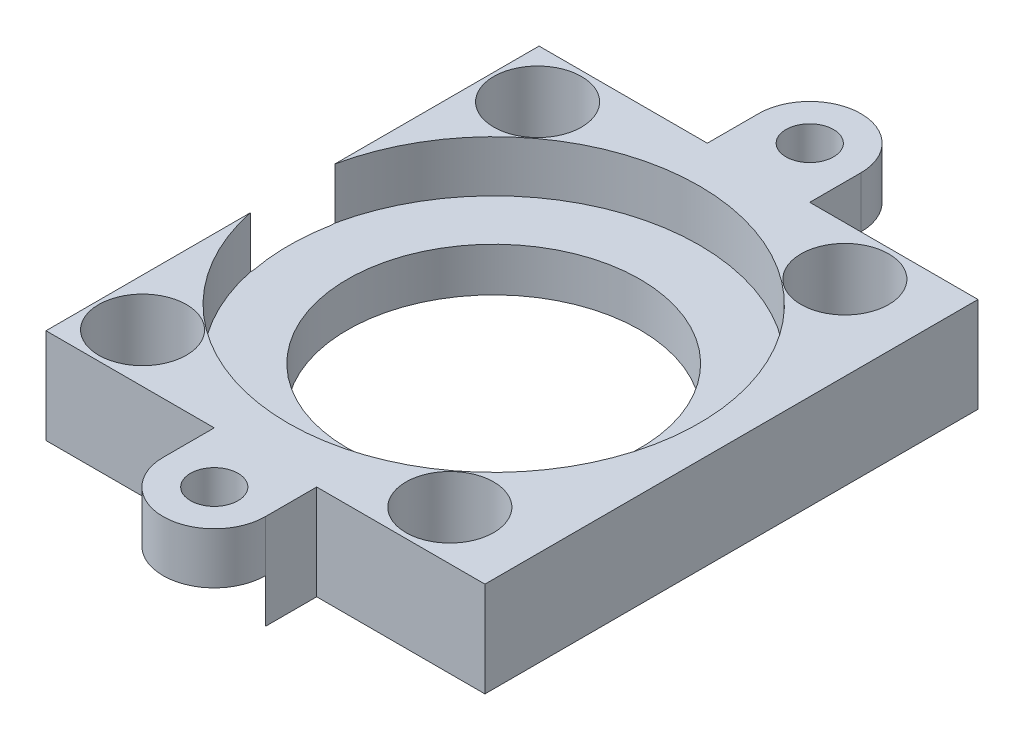
ISO-10303-21;
HEADER;
FILE_DESCRIPTION(('STEP AP214'),'2;1');
FILE_NAME('part.step','',(''),(''),'','','');
FILE_SCHEMA(('AUTOMOTIVE_DESIGN { 1 0 10303 214 1 1 1 1 }'));
ENDSEC;
DATA;
#1=APPLICATION_CONTEXT('core data for automotive mechanical design processes');
#2=APPLICATION_PROTOCOL_DEFINITION('international standard','automotive_design',2000,#1);
#3=PRODUCT_CONTEXT('',#1,'mechanical');
#4=PRODUCT('Part','Part','',(#3));
#5=PRODUCT_RELATED_PRODUCT_CATEGORY('part','',(#4));
#6=PRODUCT_DEFINITION_FORMATION('','',#4);
#7=PRODUCT_DEFINITION_CONTEXT('part definition',#1,'design');
#8=PRODUCT_DEFINITION('design','',#6,#7);
#9=PRODUCT_DEFINITION_SHAPE('','',#8);
#10=(LENGTH_UNIT() NAMED_UNIT(*) SI_UNIT(.MILLI.,.METRE.));
#11=(NAMED_UNIT(*) PLANE_ANGLE_UNIT() SI_UNIT($,.RADIAN.));
#12=(NAMED_UNIT(*) SI_UNIT($,.STERADIAN.) SOLID_ANGLE_UNIT());
#13=UNCERTAINTY_MEASURE_WITH_UNIT(LENGTH_MEASURE(1.E-05),#10,'distance_accuracy_value','');
#14=(GEOMETRIC_REPRESENTATION_CONTEXT(3) GLOBAL_UNCERTAINTY_ASSIGNED_CONTEXT((#13)) GLOBAL_UNIT_ASSIGNED_CONTEXT((#10,
#11,#12)) REPRESENTATION_CONTEXT('',''));
#15=CARTESIAN_POINT('',(0.,0.,0.));
#16=DIRECTION('',(0.,0.,1.));
#17=DIRECTION('',(1.,0.,0.));
#18=AXIS2_PLACEMENT_3D('',#15,#16,#17);
#19=CARTESIAN_POINT('',(0.,15.5,20.35));
#20=DIRECTION('',(0.,-1.,0.));
#21=DIRECTION('',(0.,0.,-1.));
#22=AXIS2_PLACEMENT_3D('',#19,#20,#21);
#23=CYLINDRICAL_SURFACE('',#22,3.5);
#24=DIRECTION('',(0.,-1.,0.));
#25=VECTOR('',#24,1.);
#26=CARTESIAN_POINT('',(-3.5,15.5,20.35));
#27=LINE('',#26,#25);
#28=CARTESIAN_POINT('',(-3.5,15.5,20.35));
#29=VERTEX_POINT('',#28);
#30=CARTESIAN_POINT('',(-3.5,12.,20.35));
#31=VERTEX_POINT('',#30);
#32=EDGE_CURVE('E321',#29,#31,#27,.T.);
#33=ORIENTED_EDGE('',*,*,#32,.T.);
#34=CARTESIAN_POINT('',(0.,12.,20.35));
#35=DIRECTION('',(0.,-1.,0.));
#36=DIRECTION('',(0.,0.,-1.));
#37=AXIS2_PLACEMENT_3D('',#34,#35,#36);
#38=CIRCLE('',#37,3.5);
#39=CARTESIAN_POINT('',(3.5,12.,20.35));
#40=VERTEX_POINT('',#39);
#41=EDGE_CURVE('E233',#40,#31,#38,.T.);
#42=ORIENTED_EDGE('',*,*,#41,.F.);
#43=DIRECTION('',(0.,-1.,0.));
#44=VECTOR('',#43,1.);
#45=CARTESIAN_POINT('',(3.5,15.5,20.35));
#46=LINE('',#45,#44);
#47=CARTESIAN_POINT('',(3.5,15.5,20.35));
#48=VERTEX_POINT('',#47);
#49=EDGE_CURVE('E326',#48,#40,#46,.T.);
#50=ORIENTED_EDGE('',*,*,#49,.F.);
#51=CARTESIAN_POINT('',(0.,15.5,20.35));
#52=DIRECTION('',(0.,-1.,0.));
#53=DIRECTION('',(0.,0.,-1.));
#54=AXIS2_PLACEMENT_3D('',#51,#52,#53);
#55=CIRCLE('',#54,3.5);
#56=EDGE_CURVE('E295',#48,#29,#55,.T.);
#57=ORIENTED_EDGE('',*,*,#56,.T.);
#58=EDGE_LOOP('',(#33,#42,#50,#57));
#59=FACE_BOUND('',#58,.T.);
#60=ADVANCED_FACE('F40',(#59),#23,.T.);
#61=CARTESIAN_POINT('',(0.,15.5,20.35));
#62=DIRECTION('',(0.,-1.,0.));
#63=DIRECTION('',(0.,0.,-1.));
#64=AXIS2_PLACEMENT_3D('',#61,#62,#63);
#65=CYLINDRICAL_SURFACE('',#64,1.625);
#66=CARTESIAN_POINT('',(0.,15.5,20.35));
#67=DIRECTION('',(0.,-1.,0.));
#68=DIRECTION('',(0.,0.,-1.));
#69=AXIS2_PLACEMENT_3D('',#66,#67,#68);
#70=CIRCLE('',#69,1.625);
#71=CARTESIAN_POINT('',(0.,15.5,18.725));
#72=VERTEX_POINT('',#71);
#73=EDGE_CURVE('E303',#72,#72,#70,.T.);
#74=CARTESIAN_POINT('',(0.,12.,20.35));
#75=DIRECTION('',(0.,-1.,0.));
#76=DIRECTION('',(0.,0.,-1.));
#77=AXIS2_PLACEMENT_3D('',#74,#75,#76);
#78=CIRCLE('',#77,1.625);
#79=CARTESIAN_POINT('',(0.,12.,18.725));
#80=VERTEX_POINT('',#79);
#81=EDGE_CURVE('E227',#80,#80,#78,.T.);
#82=CARTESIAN_POINT('',(0.,15.5,18.725));
#83=CARTESIAN_POINT('',(0.,15.4635416666667,18.725));
#84=CARTESIAN_POINT('',(0.,15.4270833333333,18.725));
#85=CARTESIAN_POINT('',(0.,15.3541666666667,18.725));
#86=CARTESIAN_POINT('',(0.,15.3177083333333,18.725));
#87=CARTESIAN_POINT('',(0.,15.2447916666667,18.725));
#88=CARTESIAN_POINT('',(0.,15.2083333333333,18.725));
#89=CARTESIAN_POINT('',(0.,15.1354166666667,18.725));
#90=CARTESIAN_POINT('',(0.,15.0989583333333,18.725));
#91=CARTESIAN_POINT('',(0.,15.0260416666667,18.725));
#92=CARTESIAN_POINT('',(0.,14.9895833333333,18.725));
#93=CARTESIAN_POINT('',(0.,14.9166666666667,18.725));
#94=CARTESIAN_POINT('',(0.,14.8802083333333,18.725));
#95=CARTESIAN_POINT('',(0.,14.8072916666667,18.725));
#96=CARTESIAN_POINT('',(0.,14.7708333333333,18.725));
#97=CARTESIAN_POINT('',(0.,14.6979166666667,18.725));
#98=CARTESIAN_POINT('',(0.,14.6614583333333,18.725));
#99=CARTESIAN_POINT('',(0.,14.5885416666667,18.725));
#100=CARTESIAN_POINT('',(0.,14.5520833333333,18.725));
#101=CARTESIAN_POINT('',(0.,14.4791666666667,18.725));
#102=CARTESIAN_POINT('',(0.,14.4427083333333,18.725));
#103=CARTESIAN_POINT('',(0.,14.3697916666667,18.725));
#104=CARTESIAN_POINT('',(0.,14.3333333333333,18.725));
#105=CARTESIAN_POINT('',(0.,14.2604166666667,18.725));
#106=CARTESIAN_POINT('',(0.,14.2239583333333,18.725));
#107=CARTESIAN_POINT('',(0.,14.1510416666667,18.725));
#108=CARTESIAN_POINT('',(0.,14.1145833333333,18.725));
#109=CARTESIAN_POINT('',(0.,14.0416666666667,18.725));
#110=CARTESIAN_POINT('',(0.,14.0052083333333,18.725));
#111=CARTESIAN_POINT('',(0.,13.9322916666667,18.725));
#112=CARTESIAN_POINT('',(0.,13.8958333333333,18.725));
#113=CARTESIAN_POINT('',(0.,13.8229166666667,18.725));
#114=CARTESIAN_POINT('',(0.,13.7864583333333,18.725));
#115=CARTESIAN_POINT('',(0.,13.7135416666667,18.725));
#116=CARTESIAN_POINT('',(0.,13.6770833333333,18.725));
#117=CARTESIAN_POINT('',(0.,13.6041666666667,18.725));
#118=CARTESIAN_POINT('',(0.,13.5677083333333,18.725));
#119=CARTESIAN_POINT('',(0.,13.4947916666667,18.725));
#120=CARTESIAN_POINT('',(0.,13.4583333333333,18.725));
#121=CARTESIAN_POINT('',(0.,13.3854166666667,18.725));
#122=CARTESIAN_POINT('',(0.,13.3489583333333,18.725));
#123=CARTESIAN_POINT('',(0.,13.2760416666667,18.725));
#124=CARTESIAN_POINT('',(0.,13.2395833333333,18.725));
#125=CARTESIAN_POINT('',(0.,13.1666666666667,18.725));
#126=CARTESIAN_POINT('',(0.,13.1302083333333,18.725));
#127=CARTESIAN_POINT('',(0.,13.0572916666667,18.725));
#128=CARTESIAN_POINT('',(0.,13.0208333333333,18.725));
#129=CARTESIAN_POINT('',(0.,12.9479166666667,18.725));
#130=CARTESIAN_POINT('',(0.,12.9114583333333,18.725));
#131=CARTESIAN_POINT('',(0.,12.8385416666667,18.725));
#132=CARTESIAN_POINT('',(0.,12.8020833333333,18.725));
#133=CARTESIAN_POINT('',(0.,12.7291666666667,18.725));
#134=CARTESIAN_POINT('',(0.,12.6927083333333,18.725));
#135=CARTESIAN_POINT('',(0.,12.6197916666667,18.725));
#136=CARTESIAN_POINT('',(0.,12.5833333333333,18.725));
#137=CARTESIAN_POINT('',(0.,12.5104166666667,18.725));
#138=CARTESIAN_POINT('',(0.,12.4739583333333,18.725));
#139=CARTESIAN_POINT('',(0.,12.4010416666667,18.725));
#140=CARTESIAN_POINT('',(0.,12.3645833333333,18.725));
#141=CARTESIAN_POINT('',(0.,12.2916666666667,18.725));
#142=CARTESIAN_POINT('',(0.,12.2552083333333,18.725));
#143=CARTESIAN_POINT('',(0.,12.1822916666667,18.725));
#144=CARTESIAN_POINT('',(0.,12.1458333333333,18.725));
#145=CARTESIAN_POINT('',(0.,12.0729166666667,18.725));
#146=CARTESIAN_POINT('',(0.,12.0364583333333,18.725));
#147=CARTESIAN_POINT('',(0.,12.,18.725));
#148=B_SPLINE_CURVE_WITH_KNOTS('',3,(#82,#83,#84,#85,#86,#87,#88,#89,#90,#91,#92,#93,#94,#95,
#96,#97,#98,#99,#100,#101,#102,#103,#104,#105,#106,#107,#108,#109,#110,#111,#112,#113,#114,#115,
#116,#117,#118,#119,#120,#121,#122,#123,#124,#125,#126,#127,#128,#129,#130,#131,#132,#133,#134,
#135,#136,#137,#138,#139,#140,#141,#142,#143,#144,#145,#146,#147),.UNSPECIFIED.,.F.,.F.,(4,2,2,
2,2,2,2,2,2,2,2,2,2,2,2,2,2,2,2,2,2,2,2,2,2,2,2,2,2,2,2,2,4),(0.,0.109374999999998,
0.218749999999998,0.328124999999999,0.437499999999999,0.546874999999999,0.656249999999999,
0.765624999999999,0.874999999999999,0.984374999999999,1.09375,1.203125,1.3125,1.421875,1.53125,
1.640625,1.75,1.859375,1.96875,2.078125,2.1875,2.296875,2.40625,2.515625,2.625,2.734375,2.84375,
2.953125,3.0625,3.171875,3.28125,3.390625,3.5),.UNSPECIFIED.);
#149=EDGE_CURVE('BSEAM425',#72,#80,#148,.T.);
#150=ORIENTED_EDGE('',*,*,#73,.F.);
#151=ORIENTED_EDGE('',*,*,#81,.T.);
#152=ORIENTED_EDGE('',*,*,#149,.T.);
#153=ORIENTED_EDGE('',*,*,#149,.F.);
#154=EDGE_LOOP('',(#150,#152,#151,#153));
#155=FACE_BOUND('',#154,.T.);
#156=ADVANCED_FACE('F425',(#155),#65,.F.);
#157=CARTESIAN_POINT('',(0.,15.5,-20.35));
#158=DIRECTION('',(0.,-1.,0.));
#159=DIRECTION('',(0.,0.,-1.));
#160=AXIS2_PLACEMENT_3D('',#157,#158,#159);
#161=CYLINDRICAL_SURFACE('',#160,3.5);
#162=DIRECTION('',(0.,-1.,0.));
#163=VECTOR('',#162,1.);
#164=CARTESIAN_POINT('',(3.5,15.5,-20.35));
#165=LINE('',#164,#163);
#166=CARTESIAN_POINT('',(3.5,15.5,-20.35));
#167=VERTEX_POINT('',#166);
#168=CARTESIAN_POINT('',(3.5,12.,-20.35));
#169=VERTEX_POINT('',#168);
#170=EDGE_CURVE('E288',#167,#169,#165,.T.);
#171=ORIENTED_EDGE('',*,*,#170,.T.);
#172=CARTESIAN_POINT('',(0.,12.,-20.35));
#173=DIRECTION('',(0.,-1.,0.));
#174=DIRECTION('',(0.,0.,-1.));
#175=AXIS2_PLACEMENT_3D('',#172,#173,#174);
#176=CIRCLE('',#175,3.5);
#177=CARTESIAN_POINT('',(-3.5,12.,-20.35));
#178=VERTEX_POINT('',#177);
#179=EDGE_CURVE('E246',#178,#169,#176,.T.);
#180=ORIENTED_EDGE('',*,*,#179,.F.);
#181=DIRECTION('',(0.,-1.,0.));
#182=VECTOR('',#181,1.);
#183=CARTESIAN_POINT('',(-3.5,15.5,-20.35));
#184=LINE('',#183,#182);
#185=CARTESIAN_POINT('',(-3.5,15.5,-20.35));
#186=VERTEX_POINT('',#185);
#187=EDGE_CURVE('E276',#186,#178,#184,.T.);
#188=ORIENTED_EDGE('',*,*,#187,.F.);
#189=CARTESIAN_POINT('',(0.,15.5,-20.35));
#190=DIRECTION('',(0.,-1.,0.));
#191=DIRECTION('',(0.,0.,-1.));
#192=AXIS2_PLACEMENT_3D('',#189,#190,#191);
#193=CIRCLE('',#192,3.5);
#194=EDGE_CURVE('E253',#186,#167,#193,.T.);
#195=ORIENTED_EDGE('',*,*,#194,.T.);
#196=EDGE_LOOP('',(#171,#180,#188,#195));
#197=FACE_BOUND('',#196,.T.);
#198=ADVANCED_FACE('F432',(#197),#161,.T.);
#199=CARTESIAN_POINT('',(0.,15.5,-20.35));
#200=DIRECTION('',(0.,-1.,0.));
#201=DIRECTION('',(0.,0.,-1.));
#202=AXIS2_PLACEMENT_3D('',#199,#200,#201);
#203=CYLINDRICAL_SURFACE('',#202,1.625);
#204=CARTESIAN_POINT('',(0.,15.5,-20.35));
#205=DIRECTION('',(0.,-1.,0.));
#206=DIRECTION('',(0.,0.,-1.));
#207=AXIS2_PLACEMENT_3D('',#204,#205,#206);
#208=CIRCLE('',#207,1.625);
#209=CARTESIAN_POINT('',(0.,15.5,-21.975));
#210=VERTEX_POINT('',#209);
#211=EDGE_CURVE('E265',#210,#210,#208,.T.);
#212=CARTESIAN_POINT('',(0.,12.,-20.35));
#213=DIRECTION('',(0.,-1.,0.));
#214=DIRECTION('',(0.,0.,-1.));
#215=AXIS2_PLACEMENT_3D('',#212,#213,#214);
#216=CIRCLE('',#215,1.625);
#217=CARTESIAN_POINT('',(0.,12.,-21.975));
#218=VERTEX_POINT('',#217);
#219=EDGE_CURVE('E226',#218,#218,#216,.T.);
#220=CARTESIAN_POINT('',(0.,15.5,-21.975));
#221=CARTESIAN_POINT('',(0.,15.4635416666667,-21.975));
#222=CARTESIAN_POINT('',(0.,15.4270833333333,-21.975));
#223=CARTESIAN_POINT('',(0.,15.3541666666667,-21.975));
#224=CARTESIAN_POINT('',(0.,15.3177083333333,-21.975));
#225=CARTESIAN_POINT('',(0.,15.2447916666667,-21.975));
#226=CARTESIAN_POINT('',(0.,15.2083333333333,-21.975));
#227=CARTESIAN_POINT('',(0.,15.1354166666667,-21.975));
#228=CARTESIAN_POINT('',(0.,15.0989583333333,-21.975));
#229=CARTESIAN_POINT('',(0.,15.0260416666667,-21.975));
#230=CARTESIAN_POINT('',(0.,14.9895833333333,-21.975));
#231=CARTESIAN_POINT('',(0.,14.9166666666667,-21.975));
#232=CARTESIAN_POINT('',(0.,14.8802083333333,-21.975));
#233=CARTESIAN_POINT('',(0.,14.8072916666667,-21.975));
#234=CARTESIAN_POINT('',(0.,14.7708333333333,-21.975));
#235=CARTESIAN_POINT('',(0.,14.6979166666667,-21.975));
#236=CARTESIAN_POINT('',(0.,14.6614583333333,-21.975));
#237=CARTESIAN_POINT('',(0.,14.5885416666667,-21.975));
#238=CARTESIAN_POINT('',(0.,14.5520833333333,-21.975));
#239=CARTESIAN_POINT('',(0.,14.4791666666667,-21.975));
#240=CARTESIAN_POINT('',(0.,14.4427083333333,-21.975));
#241=CARTESIAN_POINT('',(0.,14.3697916666667,-21.975));
#242=CARTESIAN_POINT('',(0.,14.3333333333333,-21.975));
#243=CARTESIAN_POINT('',(0.,14.2604166666667,-21.975));
#244=CARTESIAN_POINT('',(0.,14.2239583333333,-21.975));
#245=CARTESIAN_POINT('',(0.,14.1510416666667,-21.975));
#246=CARTESIAN_POINT('',(0.,14.1145833333333,-21.975));
#247=CARTESIAN_POINT('',(0.,14.0416666666667,-21.975));
#248=CARTESIAN_POINT('',(0.,14.0052083333333,-21.975));
#249=CARTESIAN_POINT('',(0.,13.9322916666667,-21.975));
#250=CARTESIAN_POINT('',(0.,13.8958333333333,-21.975));
#251=CARTESIAN_POINT('',(0.,13.8229166666667,-21.975));
#252=CARTESIAN_POINT('',(0.,13.7864583333333,-21.975));
#253=CARTESIAN_POINT('',(0.,13.7135416666667,-21.975));
#254=CARTESIAN_POINT('',(0.,13.6770833333333,-21.975));
#255=CARTESIAN_POINT('',(0.,13.6041666666667,-21.975));
#256=CARTESIAN_POINT('',(0.,13.5677083333333,-21.975));
#257=CARTESIAN_POINT('',(0.,13.4947916666667,-21.975));
#258=CARTESIAN_POINT('',(0.,13.4583333333333,-21.975));
#259=CARTESIAN_POINT('',(0.,13.3854166666667,-21.975));
#260=CARTESIAN_POINT('',(0.,13.3489583333333,-21.975));
#261=CARTESIAN_POINT('',(0.,13.2760416666667,-21.975));
#262=CARTESIAN_POINT('',(0.,13.2395833333333,-21.975));
#263=CARTESIAN_POINT('',(0.,13.1666666666667,-21.975));
#264=CARTESIAN_POINT('',(0.,13.1302083333333,-21.975));
#265=CARTESIAN_POINT('',(0.,13.0572916666667,-21.975));
#266=CARTESIAN_POINT('',(0.,13.0208333333333,-21.975));
#267=CARTESIAN_POINT('',(0.,12.9479166666667,-21.975));
#268=CARTESIAN_POINT('',(0.,12.9114583333333,-21.975));
#269=CARTESIAN_POINT('',(0.,12.8385416666667,-21.975));
#270=CARTESIAN_POINT('',(0.,12.8020833333333,-21.975));
#271=CARTESIAN_POINT('',(0.,12.7291666666667,-21.975));
#272=CARTESIAN_POINT('',(0.,12.6927083333333,-21.975));
#273=CARTESIAN_POINT('',(0.,12.6197916666667,-21.975));
#274=CARTESIAN_POINT('',(0.,12.5833333333333,-21.975));
#275=CARTESIAN_POINT('',(0.,12.5104166666667,-21.975));
#276=CARTESIAN_POINT('',(0.,12.4739583333333,-21.975));
#277=CARTESIAN_POINT('',(0.,12.4010416666667,-21.975));
#278=CARTESIAN_POINT('',(0.,12.3645833333333,-21.975));
#279=CARTESIAN_POINT('',(0.,12.2916666666667,-21.975));
#280=CARTESIAN_POINT('',(0.,12.2552083333333,-21.975));
#281=CARTESIAN_POINT('',(0.,12.1822916666667,-21.975));
#282=CARTESIAN_POINT('',(0.,12.1458333333333,-21.975));
#283=CARTESIAN_POINT('',(0.,12.0729166666667,-21.975));
#284=CARTESIAN_POINT('',(0.,12.0364583333333,-21.975));
#285=CARTESIAN_POINT('',(0.,12.,-21.975));
#286=B_SPLINE_CURVE_WITH_KNOTS('',3,(#220,#221,#222,#223,#224,#225,#226,#227,#228,#229,#230,
#231,#232,#233,#234,#235,#236,#237,#238,#239,#240,#241,#242,#243,#244,#245,#246,#247,#248,#249,
#250,#251,#252,#253,#254,#255,#256,#257,#258,#259,#260,#261,#262,#263,#264,#265,#266,#267,#268,
#269,#270,#271,#272,#273,#274,#275,#276,#277,#278,#279,#280,#281,#282,#283,#284,#285),
.UNSPECIFIED.,.F.,.F.,(4,2,2,2,2,2,2,2,2,2,2,2,2,2,2,2,2,2,2,2,2,2,2,2,2,2,2,2,2,2,2,2,4),(0.,
0.109374999999998,0.218749999999998,0.328124999999999,0.437499999999999,0.546874999999999,
0.656249999999999,0.765624999999999,0.874999999999999,0.984374999999999,1.09375,1.203125,1.3125,
1.421875,1.53125,1.640625,1.75,1.859375,1.96875,2.078125,2.1875,2.296875,2.40625,2.515625,2.625,
2.734375,2.84375,2.953125,3.0625,3.171875,3.28125,3.390625,3.5),.UNSPECIFIED.);
#287=EDGE_CURVE('BSEAM465',#210,#218,#286,.T.);
#288=ORIENTED_EDGE('',*,*,#211,.F.);
#289=ORIENTED_EDGE('',*,*,#219,.T.);
#290=ORIENTED_EDGE('',*,*,#287,.T.);
#291=ORIENTED_EDGE('',*,*,#287,.F.);
#292=EDGE_LOOP('',(#288,#290,#289,#291));
#293=FACE_BOUND('',#292,.T.);
#294=ADVANCED_FACE('F465',(#293),#203,.F.);
#295=CARTESIAN_POINT('',(0.,15.,-16.85));
#296=DIRECTION('',(0.,0.,1.));
#297=DIRECTION('',(1.,0.,0.));
#298=AXIS2_PLACEMENT_3D('',#295,#296,#297);
#299=PLANE('',#298);
#300=DIRECTION('',(0.,-1.,0.));
#301=VECTOR('',#300,1.);
#302=CARTESIAN_POINT('',(3.5,15.5,-16.85));
#303=LINE('',#302,#301);
#304=CARTESIAN_POINT('',(3.5,15.5,-16.85));
#305=VERTEX_POINT('',#304);
#306=CARTESIAN_POINT('',(3.5,9.,-16.85));
#307=VERTEX_POINT('',#306);
#308=EDGE_CURVE('E285',#305,#307,#303,.T.);
#309=ORIENTED_EDGE('',*,*,#308,.F.);
#310=DIRECTION('',(-1.,0.,0.));
#311=VECTOR('',#310,1.);
#312=CARTESIAN_POINT('',(0.,15.5,-16.85));
#313=LINE('',#312,#311);
#314=CARTESIAN_POINT('',(15.,15.5,-16.85));
#315=VERTEX_POINT('',#314);
#316=EDGE_CURVE('E371',#315,#305,#313,.T.);
#317=ORIENTED_EDGE('',*,*,#316,.F.);
#318=DIRECTION('',(0.,-1.,0.));
#319=VECTOR('',#318,1.);
#320=CARTESIAN_POINT('',(15.,15.,-16.85));
#321=LINE('',#320,#319);
#322=CARTESIAN_POINT('',(15.,9.,-16.85));
#323=VERTEX_POINT('',#322);
#324=EDGE_CURVE('E388',#315,#323,#321,.T.);
#325=ORIENTED_EDGE('',*,*,#324,.T.);
#326=DIRECTION('',(1.,0.,0.));
#327=VECTOR('',#326,1.);
#328=CARTESIAN_POINT('',(0.,9.,-16.85));
#329=LINE('',#328,#327);
#330=EDGE_CURVE('E337',#307,#323,#329,.T.);
#331=ORIENTED_EDGE('',*,*,#330,.F.);
#332=EDGE_LOOP('',(#309,#317,#325,#331));
#333=FACE_BOUND('',#332,.T.);
#334=ADVANCED_FACE('F468',(#333),#299,.F.);
#335=CARTESIAN_POINT('',(0.,15.,16.85));
#336=DIRECTION('',(0.,0.,1.));
#337=DIRECTION('',(1.,0.,0.));
#338=AXIS2_PLACEMENT_3D('',#335,#336,#337);
#339=PLANE('',#338);
#340=DIRECTION('',(1.,0.,0.));
#341=VECTOR('',#340,1.);
#342=CARTESIAN_POINT('',(0.,15.5,16.85));
#343=LINE('',#342,#341);
#344=CARTESIAN_POINT('',(3.5,15.5,16.85));
#345=VERTEX_POINT('',#344);
#346=CARTESIAN_POINT('',(15.,15.5,16.85));
#347=VERTEX_POINT('',#346);
#348=EDGE_CURVE('E361',#345,#347,#343,.T.);
#349=ORIENTED_EDGE('',*,*,#348,.F.);
#350=DIRECTION('',(0.,-1.,0.));
#351=VECTOR('',#350,1.);
#352=CARTESIAN_POINT('',(3.5,15.5,16.85));
#353=LINE('',#352,#351);
#354=CARTESIAN_POINT('',(3.5,9.,16.85));
#355=VERTEX_POINT('',#354);
#356=EDGE_CURVE('E313',#345,#355,#353,.T.);
#357=ORIENTED_EDGE('',*,*,#356,.T.);
#358=DIRECTION('',(1.,0.,0.));
#359=VECTOR('',#358,1.);
#360=CARTESIAN_POINT('',(0.,9.,16.85));
#361=LINE('',#360,#359);
#362=CARTESIAN_POINT('',(15.,9.,16.85));
#363=VERTEX_POINT('',#362);
#364=EDGE_CURVE('E346',#355,#363,#361,.T.);
#365=ORIENTED_EDGE('',*,*,#364,.T.);
#366=DIRECTION('',(0.,-1.,0.));
#367=VECTOR('',#366,1.);
#368=CARTESIAN_POINT('',(15.,15.,16.85));
#369=LINE('',#368,#367);
#370=EDGE_CURVE('E392',#347,#363,#369,.T.);
#371=ORIENTED_EDGE('',*,*,#370,.F.);
#372=EDGE_LOOP('',(#349,#357,#365,#371));
#373=FACE_BOUND('',#372,.T.);
#374=ADVANCED_FACE('F517',(#373),#339,.T.);
#375=CARTESIAN_POINT('',(-15.,15.,0.));
#376=DIRECTION('',(-1.,0.,0.));
#377=DIRECTION('',(0.,0.,1.));
#378=AXIS2_PLACEMENT_3D('',#375,#376,#377);
#379=PLANE('',#378);
#380=DIRECTION('',(0.,1.,0.));
#381=VECTOR('',#380,1.);
#382=CARTESIAN_POINT('',(-15.,12.,2.88790581563874));
#383=LINE('',#382,#381);
#384=CARTESIAN_POINT('',(-15.,12.,2.88790581563874));
#385=VERTEX_POINT('',#384);
#386=CARTESIAN_POINT('',(-15.,15.5,2.88790581563874));
#387=VERTEX_POINT('',#386);
#388=EDGE_CURVE('E55',#385,#387,#383,.T.);
#389=ORIENTED_EDGE('',*,*,#388,.F.);
#390=DIRECTION('',(0.,0.,-1.));
#391=VECTOR('',#390,1.);
#392=CARTESIAN_POINT('',(-15.,12.,0.));
#393=LINE('',#392,#391);
#394=CARTESIAN_POINT('',(-15.,12.,2.63391343821319));
#395=VERTEX_POINT('',#394);
#396=EDGE_CURVE('E179',#385,#395,#393,.T.);
#397=ORIENTED_EDGE('',*,*,#396,.T.);
#398=DIRECTION('',(0.,-1.,0.));
#399=VECTOR('',#398,1.);
#400=CARTESIAN_POINT('',(-15.,15.,2.63391343821319));
#401=LINE('',#400,#399);
#402=CARTESIAN_POINT('',(-15.,9.,2.63391343821319));
#403=VERTEX_POINT('',#402);
#404=EDGE_CURVE('E49',#395,#403,#401,.T.);
#405=ORIENTED_EDGE('',*,*,#404,.T.);
#406=DIRECTION('',(0.,0.,1.));
#407=VECTOR('',#406,1.);
#408=CARTESIAN_POINT('',(-15.,9.,0.));
#409=LINE('',#408,#407);
#410=CARTESIAN_POINT('',(-15.,9.,16.85));
#411=VERTEX_POINT('',#410);
#412=EDGE_CURVE('E351',#403,#411,#409,.T.);
#413=ORIENTED_EDGE('',*,*,#412,.T.);
#414=DIRECTION('',(0.,-1.,0.));
#415=VECTOR('',#414,1.);
#416=CARTESIAN_POINT('',(-15.,15.,16.85));
#417=LINE('',#416,#415);
#418=CARTESIAN_POINT('',(-15.,15.5,16.85));
#419=VERTEX_POINT('',#418);
#420=EDGE_CURVE('E396',#419,#411,#417,.T.);
#421=ORIENTED_EDGE('',*,*,#420,.F.);
#422=DIRECTION('',(0.,0.,1.));
#423=VECTOR('',#422,1.);
#424=CARTESIAN_POINT('',(-15.,15.5,0.));
#425=LINE('',#424,#423);
#426=EDGE_CURVE('E358',#387,#419,#425,.T.);
#427=ORIENTED_EDGE('',*,*,#426,.F.);
#428=EDGE_LOOP('',(#389,#397,#405,#413,#421,#427));
#429=FACE_BOUND('',#428,.T.);
#430=ADVANCED_FACE('F694',(#429),#379,.T.);
#431=DIRECTION('',(0.,-1.,0.));
#432=VECTOR('',#431,1.);
#433=CARTESIAN_POINT('',(-3.5,15.5,16.85));
#434=LINE('',#433,#432);
#435=CARTESIAN_POINT('',(-3.5,15.5,16.85));
#436=VERTEX_POINT('',#435);
#437=CARTESIAN_POINT('',(-3.5,9.,16.85));
#438=VERTEX_POINT('',#437);
#439=EDGE_CURVE('E318',#436,#438,#434,.T.);
#440=ORIENTED_EDGE('',*,*,#439,.F.);
#441=EDGE_CURVE('E362',#419,#436,#343,.T.);
#442=ORIENTED_EDGE('',*,*,#441,.F.);
#443=ORIENTED_EDGE('',*,*,#420,.T.);
#444=EDGE_CURVE('E347',#411,#438,#361,.T.);
#445=ORIENTED_EDGE('',*,*,#444,.T.);
#446=EDGE_LOOP('',(#440,#442,#443,#445));
#447=FACE_BOUND('',#446,.T.);
#448=ADVANCED_FACE('F42',(#447),#339,.T.);
#449=CARTESIAN_POINT('',(15.,15.,0.));
#450=DIRECTION('',(-1.,0.,0.));
#451=DIRECTION('',(0.,0.,1.));
#452=AXIS2_PLACEMENT_3D('',#449,#450,#451);
#453=PLANE('',#452);
#454=DIRECTION('',(0.,0.,1.));
#455=VECTOR('',#454,1.);
#456=CARTESIAN_POINT('',(15.,9.,0.));
#457=LINE('',#456,#455);
#458=EDGE_CURVE('E342',#323,#363,#457,.T.);
#459=ORIENTED_EDGE('',*,*,#458,.F.);
#460=ORIENTED_EDGE('',*,*,#324,.F.);
#461=DIRECTION('',(0.,0.,-1.));
#462=VECTOR('',#461,1.);
#463=CARTESIAN_POINT('',(15.,15.5,0.));
#464=LINE('',#463,#462);
#465=EDGE_CURVE('E366',#347,#315,#464,.T.);
#466=ORIENTED_EDGE('',*,*,#465,.F.);
#467=ORIENTED_EDGE('',*,*,#370,.T.);
#468=EDGE_LOOP('',(#459,#460,#466,#467));
#469=FACE_BOUND('',#468,.T.);
#470=ADVANCED_FACE('F508',(#469),#453,.F.);
#471=CARTESIAN_POINT('',(-3.5,15.5,-16.85));
#472=VERTEX_POINT('',#471);
#473=CARTESIAN_POINT('',(-15.,15.5,-16.85));
#474=VERTEX_POINT('',#473);
#475=EDGE_CURVE('E370',#472,#474,#313,.T.);
#476=ORIENTED_EDGE('',*,*,#475,.F.);
#477=DIRECTION('',(0.,-1.,0.));
#478=VECTOR('',#477,1.);
#479=CARTESIAN_POINT('',(-3.5,15.5,-16.85));
#480=LINE('',#479,#478);
#481=CARTESIAN_POINT('',(-3.5,9.,-16.85));
#482=VERTEX_POINT('',#481);
#483=EDGE_CURVE('E281',#472,#482,#480,.T.);
#484=ORIENTED_EDGE('',*,*,#483,.T.);
#485=CARTESIAN_POINT('',(-15.,9.,-16.85));
#486=VERTEX_POINT('',#485);
#487=EDGE_CURVE('E338',#486,#482,#329,.T.);
#488=ORIENTED_EDGE('',*,*,#487,.F.);
#489=DIRECTION('',(0.,-1.,0.));
#490=VECTOR('',#489,1.);
#491=CARTESIAN_POINT('',(-15.,15.,-16.85));
#492=LINE('',#491,#490);
#493=EDGE_CURVE('E384',#474,#486,#492,.T.);
#494=ORIENTED_EDGE('',*,*,#493,.F.);
#495=EDGE_LOOP('',(#476,#484,#488,#494));
#496=FACE_BOUND('',#495,.T.);
#497=ADVANCED_FACE('F492',(#496),#299,.F.);
#498=DIRECTION('',(0.,1.,0.));
#499=VECTOR('',#498,1.);
#500=CARTESIAN_POINT('',(-15.,12.,-2.88790581563874));
#501=LINE('',#500,#499);
#502=CARTESIAN_POINT('',(-15.,15.5,-2.88790581563874));
#503=VERTEX_POINT('',#502);
#504=CARTESIAN_POINT('',(-15.,12.,-2.88790581563874));
#505=VERTEX_POINT('',#504);
#506=EDGE_CURVE('E164',#503,#505,#501,.F.);
#507=ORIENTED_EDGE('',*,*,#506,.F.);
#508=DIRECTION('',(0.,0.,1.));
#509=VECTOR('',#508,1.);
#510=CARTESIAN_POINT('',(-15.,15.5,0.));
#511=LINE('',#510,#509);
#512=EDGE_CURVE('E355',#474,#503,#511,.T.);
#513=ORIENTED_EDGE('',*,*,#512,.F.);
#514=ORIENTED_EDGE('',*,*,#493,.T.);
#515=DIRECTION('',(0.,0.,1.));
#516=VECTOR('',#515,1.);
#517=CARTESIAN_POINT('',(-15.,9.,0.));
#518=LINE('',#517,#516);
#519=CARTESIAN_POINT('',(-15.,9.,-2.63391343821319));
#520=VERTEX_POINT('',#519);
#521=EDGE_CURVE('E334',#486,#520,#518,.T.);
#522=ORIENTED_EDGE('',*,*,#521,.T.);
#523=DIRECTION('',(0.,-1.,0.));
#524=VECTOR('',#523,1.);
#525=CARTESIAN_POINT('',(-15.,15.,-2.63391343821319));
#526=LINE('',#525,#524);
#527=CARTESIAN_POINT('',(-15.,12.,-2.63391343821319));
#528=VERTEX_POINT('',#527);
#529=EDGE_CURVE('E186',#528,#520,#526,.T.);
#530=ORIENTED_EDGE('',*,*,#529,.F.);
#531=DIRECTION('',(0.,0.,-1.));
#532=VECTOR('',#531,1.);
#533=CARTESIAN_POINT('',(-15.,12.,0.));
#534=LINE('',#533,#532);
#535=EDGE_CURVE('E177',#528,#505,#534,.T.);
#536=ORIENTED_EDGE('',*,*,#535,.T.);
#537=EDGE_LOOP('',(#507,#513,#514,#522,#530,#536));
#538=FACE_BOUND('',#537,.T.);
#539=ADVANCED_FACE('F183',(#538),#379,.T.);
#540=CARTESIAN_POINT('',(-1.25,7.,0.));
#541=DIRECTION('',(0.,1.,0.));
#542=DIRECTION('',(0.,0.,1.));
#543=AXIS2_PLACEMENT_3D('',#540,#541,#542);
#544=CYLINDRICAL_SURFACE('',#543,14.);
#545=ORIENTED_EDGE('',*,*,#529,.T.);
#546=CARTESIAN_POINT('',(-1.25,9.,0.));
#547=DIRECTION('',(0.,-1.,0.));
#548=DIRECTION('',(0.,0.,-1.));
#549=AXIS2_PLACEMENT_3D('',#546,#547,#548);
#550=CIRCLE('',#549,14.);
#551=EDGE_CURVE('E330',#520,#403,#550,.F.);
#552=ORIENTED_EDGE('',*,*,#551,.T.);
#553=ORIENTED_EDGE('',*,*,#404,.F.);
#554=CARTESIAN_POINT('',(-1.25,12.,0.));
#555=DIRECTION('',(0.,1.,0.));
#556=DIRECTION('',(0.,0.,1.));
#557=AXIS2_PLACEMENT_3D('',#554,#555,#556);
#558=CIRCLE('',#557,14.);
#559=EDGE_CURVE('E379',#528,#395,#558,.T.);
#560=ORIENTED_EDGE('',*,*,#559,.F.);
#561=EDGE_LOOP('',(#545,#552,#553,#560));
#562=FACE_BOUND('',#561,.T.);
#563=ADVANCED_FACE('F410',(#562),#544,.T.);
#564=CARTESIAN_POINT('',(-1.25,7.,0.));
#565=DIRECTION('',(0.,1.,0.));
#566=DIRECTION('',(0.,0.,1.));
#567=AXIS2_PLACEMENT_3D('',#564,#565,#566);
#568=CYLINDRICAL_SURFACE('',#567,10.);
#569=CARTESIAN_POINT('',(-1.25,12.,0.));
#570=DIRECTION('',(0.,1.,0.));
#571=DIRECTION('',(0.,0.,1.));
#572=AXIS2_PLACEMENT_3D('',#569,#570,#571);
#573=CIRCLE('',#572,10.);
#574=CARTESIAN_POINT('',(-1.25,12.,10.));
#575=VERTEX_POINT('',#574);
#576=EDGE_CURVE('E375',#575,#575,#573,.T.);
#577=ORIENTED_EDGE('',*,*,#576,.T.);
#578=EDGE_LOOP('',(#577));
#579=FACE_BOUND('',#578,.T.);
#580=CARTESIAN_POINT('',(-1.25,9.,0.));
#581=DIRECTION('',(0.,-1.,0.));
#582=DIRECTION('',(0.,0.,-1.));
#583=AXIS2_PLACEMENT_3D('',#580,#581,#582);
#584=CIRCLE('',#583,10.);
#585=CARTESIAN_POINT('',(-1.25,9.,-10.));
#586=VERTEX_POINT('',#585);
#587=EDGE_CURVE('E317',#586,#586,#584,.F.);
#588=ORIENTED_EDGE('',*,*,#587,.F.);
#589=EDGE_LOOP('',(#588));
#590=FACE_BOUND('',#589,.T.);
#591=ADVANCED_FACE('F408',(#579,#590),#568,.F.);
#592=CARTESIAN_POINT('',(-1.25,12.,0.));
#593=DIRECTION('',(0.,1.,0.));
#594=DIRECTION('',(0.,0.,1.));
#595=AXIS2_PLACEMENT_3D('',#592,#593,#594);
#596=PLANE('',#595);
#597=ORIENTED_EDGE('',*,*,#576,.F.);
#598=EDGE_LOOP('',(#597));
#599=FACE_BOUND('',#598,.T.);
#600=ORIENTED_EDGE('',*,*,#559,.T.);
#601=ORIENTED_EDGE('',*,*,#396,.F.);
#602=CARTESIAN_POINT('',(-1.25,12.,0.));
#603=DIRECTION('',(0.,1.,0.));
#604=DIRECTION('',(0.,0.,1.));
#605=AXIS2_PLACEMENT_3D('',#602,#603,#604);
#606=CIRCLE('',#605,14.05);
#607=EDGE_CURVE('E167',#385,#505,#606,.T.);
#608=ORIENTED_EDGE('',*,*,#607,.T.);
#609=ORIENTED_EDGE('',*,*,#535,.F.);
#610=EDGE_LOOP('',(#600,#601,#608,#609));
#611=FACE_BOUND('',#610,.T.);
#612=ADVANCED_FACE('F176',(#599,#611),#596,.T.);
#613=CARTESIAN_POINT('',(0.,15.5,0.));
#614=DIRECTION('',(0.,1.,0.));
#615=DIRECTION('',(0.,0.,1.));
#616=AXIS2_PLACEMENT_3D('',#613,#614,#615);
#617=PLANE('',#616);
#618=CARTESIAN_POINT('',(-1.25,15.5,0.));
#619=DIRECTION('',(0.,1.,0.));
#620=DIRECTION('',(0.,0.,1.));
#621=AXIS2_PLACEMENT_3D('',#618,#619,#620);
#622=CIRCLE('',#621,14.05);
#623=EDGE_CURVE('E11',#387,#503,#622,.T.);
#624=ORIENTED_EDGE('',*,*,#623,.F.);
#625=ORIENTED_EDGE('',*,*,#426,.T.);
#626=ORIENTED_EDGE('',*,*,#441,.T.);
#627=DIRECTION('',(0.,0.,-1.));
#628=VECTOR('',#627,1.);
#629=CARTESIAN_POINT('',(-3.5,15.5,0.));
#630=LINE('',#629,#628);
#631=EDGE_CURVE('E300',#29,#436,#630,.T.);
#632=ORIENTED_EDGE('',*,*,#631,.F.);
#633=ORIENTED_EDGE('',*,*,#56,.F.);
#634=DIRECTION('',(0.,0.,-1.));
#635=VECTOR('',#634,1.);
#636=CARTESIAN_POINT('',(3.5,15.5,0.));
#637=LINE('',#636,#635);
#638=EDGE_CURVE('E292',#48,#345,#637,.T.);
#639=ORIENTED_EDGE('',*,*,#638,.T.);
#640=ORIENTED_EDGE('',*,*,#348,.T.);
#641=ORIENTED_EDGE('',*,*,#465,.T.);
#642=ORIENTED_EDGE('',*,*,#316,.T.);
#643=DIRECTION('',(0.,0.,-1.));
#644=VECTOR('',#643,1.);
#645=CARTESIAN_POINT('',(3.5,15.5,0.));
#646=LINE('',#645,#644);
#647=EDGE_CURVE('E257',#305,#167,#646,.T.);
#648=ORIENTED_EDGE('',*,*,#647,.T.);
#649=ORIENTED_EDGE('',*,*,#194,.F.);
#650=DIRECTION('',(0.,0.,-1.));
#651=VECTOR('',#650,1.);
#652=CARTESIAN_POINT('',(-3.5,15.5,0.));
#653=LINE('',#652,#651);
#654=EDGE_CURVE('E261',#472,#186,#653,.T.);
#655=ORIENTED_EDGE('',*,*,#654,.F.);
#656=ORIENTED_EDGE('',*,*,#475,.T.);
#657=ORIENTED_EDGE('',*,*,#512,.T.);
#658=EDGE_LOOP('',(#624,#625,#626,#632,#633,#639,#640,#641,#642,#648,#649,#655,#656,#657));
#659=FACE_BOUND('',#658,.T.);
#660=CARTESIAN_POINT('',(-11.75,15.5,-13.5));
#661=DIRECTION('',(0.,1.,0.));
#662=DIRECTION('',(0.,0.,1.));
#663=AXIS2_PLACEMENT_3D('',#660,#661,#662);
#664=CIRCLE('',#663,3.);
#665=CARTESIAN_POINT('',(-11.75,15.5,-10.5));
#666=VERTEX_POINT('',#665);
#667=EDGE_CURVE('E222',#666,#666,#664,.T.);
#668=ORIENTED_EDGE('',*,*,#667,.F.);
#669=EDGE_LOOP('',(#668));
#670=FACE_BOUND('',#669,.T.);
#671=CARTESIAN_POINT('',(9.24999999999999,15.5,-13.5));
#672=DIRECTION('',(0.,1.,0.));
#673=DIRECTION('',(0.,0.,1.));
#674=AXIS2_PLACEMENT_3D('',#671,#672,#673);
#675=CIRCLE('',#674,3.);
#676=CARTESIAN_POINT('',(9.24999999999999,15.5,-10.5));
#677=VERTEX_POINT('',#676);
#678=EDGE_CURVE('E218',#677,#677,#675,.T.);
#679=ORIENTED_EDGE('',*,*,#678,.F.);
#680=EDGE_LOOP('',(#679));
#681=FACE_BOUND('',#680,.T.);
#682=CARTESIAN_POINT('',(9.25,15.5,13.5));
#683=DIRECTION('',(0.,1.,0.));
#684=DIRECTION('',(0.,0.,1.));
#685=AXIS2_PLACEMENT_3D('',#682,#683,#684);
#686=CIRCLE('',#685,3.);
#687=CARTESIAN_POINT('',(9.25,15.5,16.5));
#688=VERTEX_POINT('',#687);
#689=EDGE_CURVE('E214',#688,#688,#686,.T.);
#690=ORIENTED_EDGE('',*,*,#689,.F.);
#691=EDGE_LOOP('',(#690));
#692=FACE_BOUND('',#691,.T.);
#693=CARTESIAN_POINT('',(-11.75,15.5,13.5));
#694=DIRECTION('',(0.,1.,0.));
#695=DIRECTION('',(0.,0.,1.));
#696=AXIS2_PLACEMENT_3D('',#693,#694,#695);
#697=CIRCLE('',#696,3.);
#698=CARTESIAN_POINT('',(-11.75,15.5,16.5));
#699=VERTEX_POINT('',#698);
#700=EDGE_CURVE('E210',#699,#699,#697,.T.);
#701=ORIENTED_EDGE('',*,*,#700,.F.);
#702=EDGE_LOOP('',(#701));
#703=FACE_BOUND('',#702,.T.);
#704=ORIENTED_EDGE('',*,*,#73,.T.);
#705=EDGE_LOOP('',(#704));
#706=FACE_BOUND('',#705,.T.);
#707=ORIENTED_EDGE('',*,*,#211,.T.);
#708=EDGE_LOOP('',(#707));
#709=FACE_BOUND('',#708,.T.);
#710=ADVANCED_FACE('F418',(#659,#670,#681,#692,#703,#706,#709),#617,.T.);
#711=CARTESIAN_POINT('',(0.,9.,0.));
#712=DIRECTION('',(0.,-1.,0.));
#713=DIRECTION('',(0.,0.,-1.));
#714=AXIS2_PLACEMENT_3D('',#711,#712,#713);
#715=PLANE('',#714);
#716=CARTESIAN_POINT('',(-11.75,9.,-13.5));
#717=DIRECTION('',(0.,-1.,0.));
#718=DIRECTION('',(0.,0.,-1.));
#719=AXIS2_PLACEMENT_3D('',#716,#717,#718);
#720=CIRCLE('',#719,3.);
#721=CARTESIAN_POINT('',(-11.75,9.,-16.5));
#722=VERTEX_POINT('',#721);
#723=EDGE_CURVE('E191',#722,#722,#720,.T.);
#724=ORIENTED_EDGE('',*,*,#723,.F.);
#725=EDGE_LOOP('',(#724));
#726=FACE_BOUND('',#725,.T.);
#727=CARTESIAN_POINT('',(9.24999999999999,9.,-13.5));
#728=DIRECTION('',(0.,-1.,0.));
#729=DIRECTION('',(0.,0.,-1.));
#730=AXIS2_PLACEMENT_3D('',#727,#728,#729);
#731=CIRCLE('',#730,3.);
#732=CARTESIAN_POINT('',(9.24999999999999,9.,-16.5));
#733=VERTEX_POINT('',#732);
#734=EDGE_CURVE('E200',#733,#733,#731,.T.);
#735=ORIENTED_EDGE('',*,*,#734,.F.);
#736=EDGE_LOOP('',(#735));
#737=FACE_BOUND('',#736,.T.);
#738=CARTESIAN_POINT('',(9.25,9.,13.5));
#739=DIRECTION('',(0.,-1.,0.));
#740=DIRECTION('',(0.,0.,-1.));
#741=AXIS2_PLACEMENT_3D('',#738,#739,#740);
#742=CIRCLE('',#741,3.);
#743=CARTESIAN_POINT('',(9.25,9.,10.5));
#744=VERTEX_POINT('',#743);
#745=EDGE_CURVE('E195',#744,#744,#742,.T.);
#746=ORIENTED_EDGE('',*,*,#745,.F.);
#747=EDGE_LOOP('',(#746));
#748=FACE_BOUND('',#747,.T.);
#749=CARTESIAN_POINT('',(-11.75,9.,13.5));
#750=DIRECTION('',(0.,-1.,0.));
#751=DIRECTION('',(0.,0.,-1.));
#752=AXIS2_PLACEMENT_3D('',#749,#750,#751);
#753=CIRCLE('',#752,3.);
#754=CARTESIAN_POINT('',(-11.75,9.,10.5));
#755=VERTEX_POINT('',#754);
#756=EDGE_CURVE('E199',#755,#755,#753,.T.);
#757=ORIENTED_EDGE('',*,*,#756,.F.);
#758=EDGE_LOOP('',(#757));
#759=FACE_BOUND('',#758,.T.);
#760=CARTESIAN_POINT('',(0.,9.,20.35));
#761=DIRECTION('',(0.,-1.,0.));
#762=DIRECTION('',(0.,0.,-1.));
#763=AXIS2_PLACEMENT_3D('',#760,#761,#762);
#764=CIRCLE('',#763,3.5);
#765=CARTESIAN_POINT('',(-3.5,9.,20.35));
#766=VERTEX_POINT('',#765);
#767=CARTESIAN_POINT('',(3.5,9.,20.35));
#768=VERTEX_POINT('',#767);
#769=EDGE_CURVE('E231',#766,#768,#764,.T.);
#770=ORIENTED_EDGE('',*,*,#769,.F.);
#771=DIRECTION('',(0.,0.,-1.));
#772=VECTOR('',#771,1.);
#773=CARTESIAN_POINT('',(-3.5,9.,0.));
#774=LINE('',#773,#772);
#775=EDGE_CURVE('E296',#766,#438,#774,.T.);
#776=ORIENTED_EDGE('',*,*,#775,.T.);
#777=ORIENTED_EDGE('',*,*,#444,.F.);
#778=ORIENTED_EDGE('',*,*,#412,.F.);
#779=ORIENTED_EDGE('',*,*,#551,.F.);
#780=ORIENTED_EDGE('',*,*,#521,.F.);
#781=ORIENTED_EDGE('',*,*,#487,.T.);
#782=DIRECTION('',(0.,0.,-1.));
#783=VECTOR('',#782,1.);
#784=CARTESIAN_POINT('',(-3.5,9.,0.));
#785=LINE('',#784,#783);
#786=CARTESIAN_POINT('',(-3.5,9.,-20.35));
#787=VERTEX_POINT('',#786);
#788=EDGE_CURVE('E258',#482,#787,#785,.T.);
#789=ORIENTED_EDGE('',*,*,#788,.T.);
#790=CARTESIAN_POINT('',(0.,9.,-20.35));
#791=DIRECTION('',(0.,-1.,0.));
#792=DIRECTION('',(0.,0.,-1.));
#793=AXIS2_PLACEMENT_3D('',#790,#791,#792);
#794=CIRCLE('',#793,3.5);
#795=CARTESIAN_POINT('',(3.5,9.,-20.35));
#796=VERTEX_POINT('',#795);
#797=EDGE_CURVE('E242',#796,#787,#794,.T.);
#798=ORIENTED_EDGE('',*,*,#797,.F.);
#799=DIRECTION('',(0.,0.,-1.));
#800=VECTOR('',#799,1.);
#801=CARTESIAN_POINT('',(3.5,9.,0.));
#802=LINE('',#801,#800);
#803=EDGE_CURVE('E252',#307,#796,#802,.T.);
#804=ORIENTED_EDGE('',*,*,#803,.F.);
#805=ORIENTED_EDGE('',*,*,#330,.T.);
#806=ORIENTED_EDGE('',*,*,#458,.T.);
#807=ORIENTED_EDGE('',*,*,#364,.F.);
#808=DIRECTION('',(0.,0.,-1.));
#809=VECTOR('',#808,1.);
#810=CARTESIAN_POINT('',(3.5,9.,0.));
#811=LINE('',#810,#809);
#812=EDGE_CURVE('E280',#768,#355,#811,.T.);
#813=ORIENTED_EDGE('',*,*,#812,.F.);
#814=EDGE_LOOP('',(#770,#776,#777,#778,#779,#780,#781,#789,#798,#804,#805,#806,#807,#813));
#815=FACE_BOUND('',#814,.T.);
#816=ORIENTED_EDGE('',*,*,#587,.T.);
#817=EDGE_LOOP('',(#816));
#818=FACE_BOUND('',#817,.T.);
#819=ADVANCED_FACE('F406',(#726,#737,#748,#759,#815,#818),#715,.T.);
#820=CARTESIAN_POINT('',(3.5,15.5,0.));
#821=DIRECTION('',(-1.,0.,0.));
#822=DIRECTION('',(0.,0.,1.));
#823=AXIS2_PLACEMENT_3D('',#820,#821,#822);
#824=PLANE('',#823);
#825=ORIENTED_EDGE('',*,*,#812,.T.);
#826=ORIENTED_EDGE('',*,*,#356,.F.);
#827=ORIENTED_EDGE('',*,*,#638,.F.);
#828=ORIENTED_EDGE('',*,*,#49,.T.);
#829=EDGE_CURVE('E307',#40,#768,#46,.T.);
#830=ORIENTED_EDGE('',*,*,#829,.T.);
#831=EDGE_LOOP('',(#825,#826,#827,#828,#830));
#832=FACE_BOUND('',#831,.T.);
#833=ADVANCED_FACE('F438',(#832),#824,.F.);
#834=CARTESIAN_POINT('',(-3.5,15.5,0.));
#835=DIRECTION('',(-1.,0.,0.));
#836=DIRECTION('',(0.,0.,1.));
#837=AXIS2_PLACEMENT_3D('',#834,#835,#836);
#838=PLANE('',#837);
#839=ORIENTED_EDGE('',*,*,#775,.F.);
#840=EDGE_CURVE('E325',#31,#766,#27,.T.);
#841=ORIENTED_EDGE('',*,*,#840,.F.);
#842=ORIENTED_EDGE('',*,*,#32,.F.);
#843=ORIENTED_EDGE('',*,*,#631,.T.);
#844=ORIENTED_EDGE('',*,*,#439,.T.);
#845=EDGE_LOOP('',(#839,#841,#842,#843,#844));
#846=FACE_BOUND('',#845,.T.);
#847=ADVANCED_FACE('F437',(#846),#838,.T.);
#848=CARTESIAN_POINT('',(-3.5,15.5,0.));
#849=DIRECTION('',(-1.,0.,0.));
#850=DIRECTION('',(0.,0.,1.));
#851=AXIS2_PLACEMENT_3D('',#848,#849,#850);
#852=PLANE('',#851);
#853=ORIENTED_EDGE('',*,*,#788,.F.);
#854=ORIENTED_EDGE('',*,*,#483,.F.);
#855=ORIENTED_EDGE('',*,*,#654,.T.);
#856=ORIENTED_EDGE('',*,*,#187,.T.);
#857=DIRECTION('',(0.,-1.,0.));
#858=VECTOR('',#857,1.);
#859=CARTESIAN_POINT('',(-3.5,12.,-20.35));
#860=LINE('',#859,#858);
#861=EDGE_CURVE('E236',#178,#787,#860,.T.);
#862=ORIENTED_EDGE('',*,*,#861,.T.);
#863=EDGE_LOOP('',(#853,#854,#855,#856,#862));
#864=FACE_BOUND('',#863,.T.);
#865=ADVANCED_FACE('F487',(#864),#852,.T.);
#866=CARTESIAN_POINT('',(3.5,15.5,0.));
#867=DIRECTION('',(-1.,0.,0.));
#868=DIRECTION('',(0.,0.,1.));
#869=AXIS2_PLACEMENT_3D('',#866,#867,#868);
#870=PLANE('',#869);
#871=ORIENTED_EDGE('',*,*,#803,.T.);
#872=EDGE_CURVE('E269',#169,#796,#165,.T.);
#873=ORIENTED_EDGE('',*,*,#872,.F.);
#874=ORIENTED_EDGE('',*,*,#170,.F.);
#875=ORIENTED_EDGE('',*,*,#647,.F.);
#876=ORIENTED_EDGE('',*,*,#308,.T.);
#877=EDGE_LOOP('',(#871,#873,#874,#875,#876));
#878=FACE_BOUND('',#877,.T.);
#879=ADVANCED_FACE('F528',(#878),#870,.F.);
#880=CARTESIAN_POINT('',(0.,12.,-20.35));
#881=DIRECTION('',(0.,-1.,0.));
#882=DIRECTION('',(0.,0.,-1.));
#883=AXIS2_PLACEMENT_3D('',#880,#881,#882);
#884=CYLINDRICAL_SURFACE('',#883,3.5);
#885=EDGE_CURVE('E232',#169,#178,#176,.T.);
#886=ORIENTED_EDGE('',*,*,#885,.F.);
#887=ORIENTED_EDGE('',*,*,#872,.T.);
#888=ORIENTED_EDGE('',*,*,#797,.T.);
#889=ORIENTED_EDGE('',*,*,#861,.F.);
#890=EDGE_LOOP('',(#886,#887,#888,#889));
#891=FACE_BOUND('',#890,.T.);
#892=ADVANCED_FACE('F476',(#891),#884,.F.);
#893=CARTESIAN_POINT('',(0.,12.,-20.35));
#894=DIRECTION('',(0.,-1.,0.));
#895=DIRECTION('',(0.,0.,-1.));
#896=AXIS2_PLACEMENT_3D('',#893,#894,#895);
#897=PLANE('',#896);
#898=ORIENTED_EDGE('',*,*,#219,.F.);
#899=EDGE_LOOP('',(#898));
#900=FACE_BOUND('',#899,.T.);
#901=ORIENTED_EDGE('',*,*,#885,.T.);
#902=ORIENTED_EDGE('',*,*,#179,.T.);
#903=EDGE_LOOP('',(#901,#902));
#904=FACE_BOUND('',#903,.T.);
#905=ADVANCED_FACE('F472',(#900,#904),#897,.T.);
#906=CARTESIAN_POINT('',(0.,12.,20.35));
#907=DIRECTION('',(0.,-1.,0.));
#908=DIRECTION('',(0.,0.,-1.));
#909=AXIS2_PLACEMENT_3D('',#906,#907,#908);
#910=CYLINDRICAL_SURFACE('',#909,3.5);
#911=EDGE_CURVE('E62',#31,#40,#38,.T.);
#912=ORIENTED_EDGE('',*,*,#911,.F.);
#913=ORIENTED_EDGE('',*,*,#840,.T.);
#914=ORIENTED_EDGE('',*,*,#769,.T.);
#915=ORIENTED_EDGE('',*,*,#829,.F.);
#916=EDGE_LOOP('',(#912,#913,#914,#915));
#917=FACE_BOUND('',#916,.T.);
#918=ADVANCED_FACE('F475',(#917),#910,.F.);
#919=CARTESIAN_POINT('',(0.,12.,20.35));
#920=DIRECTION('',(0.,-1.,0.));
#921=DIRECTION('',(0.,0.,-1.));
#922=AXIS2_PLACEMENT_3D('',#919,#920,#921);
#923=PLANE('',#922);
#924=ORIENTED_EDGE('',*,*,#81,.F.);
#925=EDGE_LOOP('',(#924));
#926=FACE_BOUND('',#925,.T.);
#927=ORIENTED_EDGE('',*,*,#41,.T.);
#928=ORIENTED_EDGE('',*,*,#911,.T.);
#929=EDGE_LOOP('',(#927,#928));
#930=FACE_BOUND('',#929,.T.);
#931=ADVANCED_FACE('F601',(#926,#930),#923,.T.);
#932=CARTESIAN_POINT('',(-11.75,37.,13.5));
#933=DIRECTION('',(0.,-1.,0.));
#934=DIRECTION('',(0.,0.,-1.));
#935=AXIS2_PLACEMENT_3D('',#932,#933,#934);
#936=CYLINDRICAL_SURFACE('',#935,3.);
#937=ORIENTED_EDGE('',*,*,#700,.T.);
#938=EDGE_LOOP('',(#937));
#939=FACE_BOUND('',#938,.T.);
#940=ORIENTED_EDGE('',*,*,#756,.T.);
#941=EDGE_LOOP('',(#940));
#942=FACE_BOUND('',#941,.T.);
#943=ADVANCED_FACE('F609',(#939,#942),#936,.F.);
#944=CARTESIAN_POINT('',(9.25,37.,13.5));
#945=DIRECTION('',(0.,-1.,0.));
#946=DIRECTION('',(0.,0.,-1.));
#947=AXIS2_PLACEMENT_3D('',#944,#945,#946);
#948=CYLINDRICAL_SURFACE('',#947,3.);
#949=ORIENTED_EDGE('',*,*,#689,.T.);
#950=EDGE_LOOP('',(#949));
#951=FACE_BOUND('',#950,.T.);
#952=ORIENTED_EDGE('',*,*,#745,.T.);
#953=EDGE_LOOP('',(#952));
#954=FACE_BOUND('',#953,.T.);
#955=ADVANCED_FACE('F619',(#951,#954),#948,.F.);
#956=CARTESIAN_POINT('',(9.24999999999999,37.,-13.5));
#957=DIRECTION('',(0.,-1.,0.));
#958=DIRECTION('',(0.,0.,-1.));
#959=AXIS2_PLACEMENT_3D('',#956,#957,#958);
#960=CYLINDRICAL_SURFACE('',#959,3.);
#961=ORIENTED_EDGE('',*,*,#678,.T.);
#962=EDGE_LOOP('',(#961));
#963=FACE_BOUND('',#962,.T.);
#964=ORIENTED_EDGE('',*,*,#734,.T.);
#965=EDGE_LOOP('',(#964));
#966=FACE_BOUND('',#965,.T.);
#967=ADVANCED_FACE('F626',(#963,#966),#960,.F.);
#968=CARTESIAN_POINT('',(-11.75,37.,-13.5));
#969=DIRECTION('',(0.,-1.,0.));
#970=DIRECTION('',(0.,0.,-1.));
#971=AXIS2_PLACEMENT_3D('',#968,#969,#970);
#972=CYLINDRICAL_SURFACE('',#971,3.);
#973=ORIENTED_EDGE('',*,*,#667,.T.);
#974=EDGE_LOOP('',(#973));
#975=FACE_BOUND('',#974,.T.);
#976=ORIENTED_EDGE('',*,*,#723,.T.);
#977=EDGE_LOOP('',(#976));
#978=FACE_BOUND('',#977,.T.);
#979=ADVANCED_FACE('F634',(#975,#978),#972,.F.);
#980=CARTESIAN_POINT('',(-1.25,12.,0.));
#981=DIRECTION('',(0.,1.,0.));
#982=DIRECTION('',(0.,0.,1.));
#983=AXIS2_PLACEMENT_3D('',#980,#981,#982);
#984=CYLINDRICAL_SURFACE('',#983,14.05);
#985=ORIENTED_EDGE('',*,*,#388,.T.);
#986=ORIENTED_EDGE('',*,*,#623,.T.);
#987=ORIENTED_EDGE('',*,*,#506,.T.);
#988=ORIENTED_EDGE('',*,*,#607,.F.);
#989=EDGE_LOOP('',(#985,#986,#987,#988));
#990=FACE_BOUND('',#989,.T.);
#991=ADVANCED_FACE('F166',(#990),#984,.F.);
#992=CLOSED_SHELL('',(#60,#156,#198,#294,#334,#374,#430,#448,#470,#497,#539,#563,#591,#612,#710,
#819,#833,#847,#865,#879,#892,#905,#918,#931,#943,#955,#967,#979,#991));
#993=MANIFOLD_SOLID_BREP('B2',#992);
#994=ADVANCED_BREP_SHAPE_REPRESENTATION('',(#18,#993),#14);
#995=SHAPE_DEFINITION_REPRESENTATION(#9,#994);
ENDSEC;
END-ISO-10303-21;
